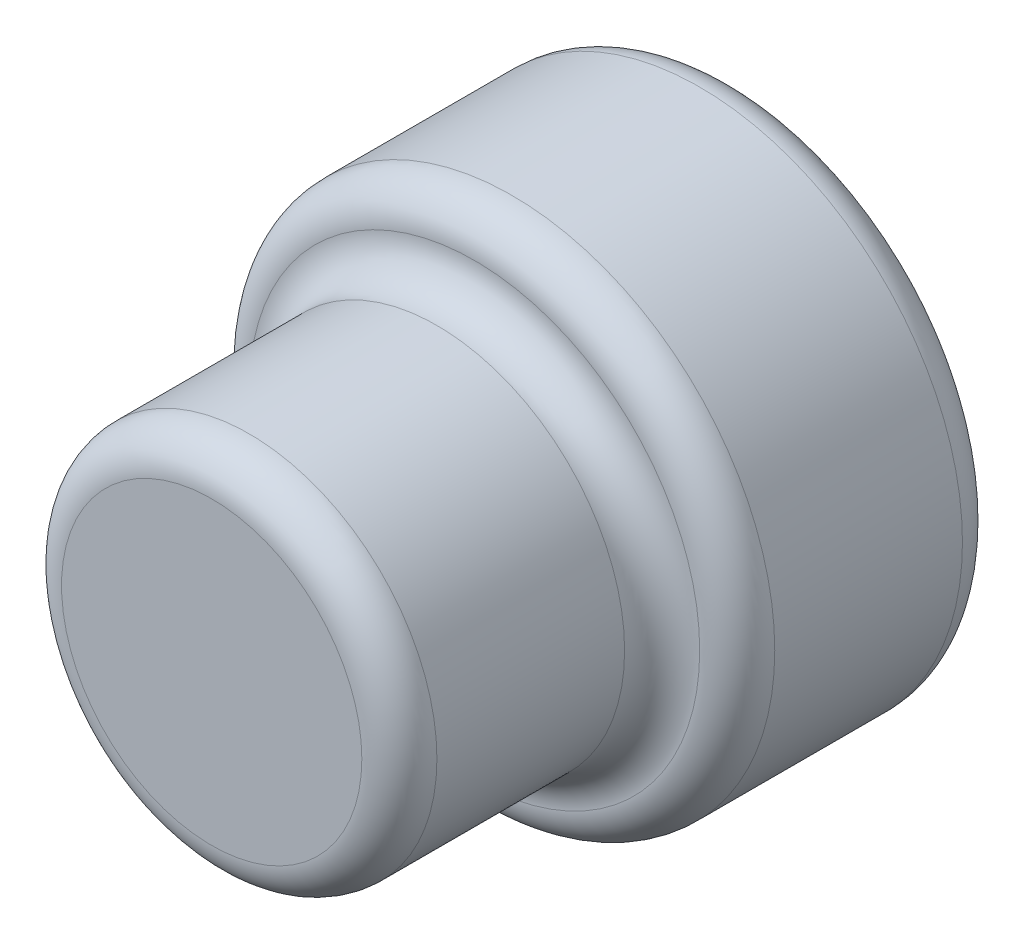
ISO-10303-21;
HEADER;
FILE_DESCRIPTION(('STEP AP214'),'2;1');
FILE_NAME('part.step','',(''),(''),'','','');
FILE_SCHEMA(('AUTOMOTIVE_DESIGN { 1 0 10303 214 1 1 1 1 }'));
ENDSEC;
DATA;
#1=APPLICATION_CONTEXT('core data for automotive mechanical design processes');
#2=APPLICATION_PROTOCOL_DEFINITION('international standard','automotive_design',2000,#1);
#3=PRODUCT_CONTEXT('',#1,'mechanical');
#4=PRODUCT('Part','Part','',(#3));
#5=PRODUCT_RELATED_PRODUCT_CATEGORY('part','',(#4));
#6=PRODUCT_DEFINITION_FORMATION('','',#4);
#7=PRODUCT_DEFINITION_CONTEXT('part definition',#1,'design');
#8=PRODUCT_DEFINITION('design','',#6,#7);
#9=PRODUCT_DEFINITION_SHAPE('','',#8);
#10=(LENGTH_UNIT() NAMED_UNIT(*) SI_UNIT(.MILLI.,.METRE.));
#11=(NAMED_UNIT(*) PLANE_ANGLE_UNIT() SI_UNIT($,.RADIAN.));
#12=(NAMED_UNIT(*) SI_UNIT($,.STERADIAN.) SOLID_ANGLE_UNIT());
#13=UNCERTAINTY_MEASURE_WITH_UNIT(LENGTH_MEASURE(1.E-05),#10,'distance_accuracy_value','');
#14=(GEOMETRIC_REPRESENTATION_CONTEXT(3) GLOBAL_UNCERTAINTY_ASSIGNED_CONTEXT((#13)) GLOBAL_UNIT_ASSIGNED_CONTEXT((#10,
#11,#12)) REPRESENTATION_CONTEXT('',''));
#15=CARTESIAN_POINT('',(0.,0.,0.));
#16=DIRECTION('',(0.,0.,1.));
#17=DIRECTION('',(1.,0.,0.));
#18=AXIS2_PLACEMENT_3D('',#15,#16,#17);
#19=CARTESIAN_POINT('',(0.,0.,7.));
#20=DIRECTION('',(0.,0.,-1.));
#21=DIRECTION('',(-1.,0.,0.));
#22=AXIS2_PLACEMENT_3D('',#19,#20,#21);
#23=CYLINDRICAL_SURFACE('',#22,7.);
#24=CARTESIAN_POINT('',(0.,0.,1.));
#25=DIRECTION('',(0.,0.,1.));
#26=DIRECTION('',(1.,0.,0.));
#27=AXIS2_PLACEMENT_3D('',#24,#25,#26);
#28=CIRCLE('',#27,7.);
#29=CARTESIAN_POINT('',(7.,0.,1.));
#30=VERTEX_POINT('',#29);
#31=EDGE_CURVE('E71',#30,#30,#28,.T.);
#32=ORIENTED_EDGE('',*,*,#31,.T.);
#33=EDGE_LOOP('',(#32));
#34=FACE_BOUND('',#33,.T.);
#35=CARTESIAN_POINT('',(0.,0.,6.));
#36=DIRECTION('',(0.,0.,1.));
#37=DIRECTION('',(1.,0.,0.));
#38=AXIS2_PLACEMENT_3D('',#35,#36,#37);
#39=CIRCLE('',#38,7.);
#40=CARTESIAN_POINT('',(7.,0.,6.));
#41=VERTEX_POINT('',#40);
#42=EDGE_CURVE('E75',#41,#41,#39,.F.);
#43=ORIENTED_EDGE('',*,*,#42,.T.);
#44=EDGE_LOOP('',(#43));
#45=FACE_BOUND('',#44,.T.);
#46=ADVANCED_FACE('F43',(#34,#45),#23,.T.);
#47=CARTESIAN_POINT('',(0.,0.,0.));
#48=DIRECTION('',(0.,0.,1.));
#49=DIRECTION('',(1.,0.,0.));
#50=AXIS2_PLACEMENT_3D('',#47,#48,#49);
#51=PLANE('',#50);
#52=CARTESIAN_POINT('',(0.,0.,0.));
#53=DIRECTION('',(0.,0.,1.));
#54=DIRECTION('',(1.,0.,0.));
#55=AXIS2_PLACEMENT_3D('',#52,#53,#54);
#56=CIRCLE('',#55,6.);
#57=CARTESIAN_POINT('',(6.,0.,0.));
#58=VERTEX_POINT('',#57);
#59=EDGE_CURVE('E67',#58,#58,#56,.F.);
#60=ORIENTED_EDGE('',*,*,#59,.T.);
#61=EDGE_LOOP('',(#60));
#62=FACE_BOUND('',#61,.T.);
#63=ADVANCED_FACE('F98',(#62),#51,.F.);
#64=CARTESIAN_POINT('',(0.,0.,1.));
#65=DIRECTION('',(0.,0.,1.));
#66=DIRECTION('',(1.,0.,0.));
#67=AXIS2_PLACEMENT_3D('',#64,#65,#66);
#68=TOROIDAL_SURFACE('',#67,6.,1.);
#69=ORIENTED_EDGE('',*,*,#59,.F.);
#70=EDGE_LOOP('',(#69));
#71=FACE_BOUND('',#70,.T.);
#72=ORIENTED_EDGE('',*,*,#31,.F.);
#73=EDGE_LOOP('',(#72));
#74=FACE_BOUND('',#73,.T.);
#75=ADVANCED_FACE('F85',(#71,#74),#68,.T.);
#76=CARTESIAN_POINT('',(0.,0.,6.));
#77=DIRECTION('',(0.,0.,1.));
#78=DIRECTION('',(1.,0.,0.));
#79=AXIS2_PLACEMENT_3D('',#76,#77,#78);
#80=TOROIDAL_SURFACE('',#79,6.,1.);
#81=ORIENTED_EDGE('',*,*,#42,.F.);
#82=EDGE_LOOP('',(#81));
#83=FACE_BOUND('',#82,.T.);
#84=CARTESIAN_POINT('',(0.,0.,7.));
#85=DIRECTION('',(0.,0.,1.));
#86=DIRECTION('',(1.,0.,0.));
#87=AXIS2_PLACEMENT_3D('',#84,#85,#86);
#88=CIRCLE('',#87,6.);
#89=CARTESIAN_POINT('',(6.,0.,7.));
#90=VERTEX_POINT('',#89);
#91=EDGE_CURVE('E61',#90,#90,#88,.T.);
#92=ORIENTED_EDGE('',*,*,#91,.F.);
#93=EDGE_LOOP('',(#92));
#94=FACE_BOUND('',#93,.T.);
#95=ADVANCED_FACE('F81',(#83,#94),#80,.T.);
#96=CARTESIAN_POINT('',(0.,0.,14.));
#97=DIRECTION('',(0.,0.,-1.));
#98=DIRECTION('',(-1.,0.,0.));
#99=AXIS2_PLACEMENT_3D('',#96,#97,#98);
#100=CYLINDRICAL_SURFACE('',#99,5.);
#101=CARTESIAN_POINT('',(0.,0.,13.));
#102=DIRECTION('',(0.,0.,1.));
#103=DIRECTION('',(1.,0.,0.));
#104=AXIS2_PLACEMENT_3D('',#101,#102,#103);
#105=CIRCLE('',#104,5.);
#106=CARTESIAN_POINT('',(5.,0.,13.));
#107=VERTEX_POINT('',#106);
#108=EDGE_CURVE('E10',#107,#107,#105,.F.);
#109=ORIENTED_EDGE('',*,*,#108,.T.);
#110=EDGE_LOOP('',(#109));
#111=FACE_BOUND('',#110,.T.);
#112=CARTESIAN_POINT('',(0.,0.,8.));
#113=DIRECTION('',(0.,0.,1.));
#114=DIRECTION('',(1.,0.,0.));
#115=AXIS2_PLACEMENT_3D('',#112,#113,#114);
#116=CIRCLE('',#115,5.);
#117=CARTESIAN_POINT('',(5.,0.,8.));
#118=VERTEX_POINT('',#117);
#119=EDGE_CURVE('E51',#118,#118,#116,.T.);
#120=ORIENTED_EDGE('',*,*,#119,.T.);
#121=EDGE_LOOP('',(#120));
#122=FACE_BOUND('',#121,.T.);
#123=ADVANCED_FACE('F84',(#111,#122),#100,.T.);
#124=CARTESIAN_POINT('',(0.,0.,14.));
#125=DIRECTION('',(0.,0.,1.));
#126=DIRECTION('',(1.,0.,0.));
#127=AXIS2_PLACEMENT_3D('',#124,#125,#126);
#128=PLANE('',#127);
#129=CARTESIAN_POINT('',(0.,0.,14.));
#130=DIRECTION('',(0.,0.,1.));
#131=DIRECTION('',(1.,0.,0.));
#132=AXIS2_PLACEMENT_3D('',#129,#130,#131);
#133=CIRCLE('',#132,4.);
#134=CARTESIAN_POINT('',(4.,0.,14.));
#135=VERTEX_POINT('',#134);
#136=EDGE_CURVE('E56',#135,#135,#133,.T.);
#137=ORIENTED_EDGE('',*,*,#136,.T.);
#138=EDGE_LOOP('',(#137));
#139=FACE_BOUND('',#138,.T.);
#140=ADVANCED_FACE('F95',(#139),#128,.T.);
#141=CARTESIAN_POINT('',(0.,0.,13.));
#142=DIRECTION('',(0.,0.,1.));
#143=DIRECTION('',(1.,0.,0.));
#144=AXIS2_PLACEMENT_3D('',#141,#142,#143);
#145=TOROIDAL_SURFACE('',#144,4.,1.);
#146=ORIENTED_EDGE('',*,*,#108,.F.);
#147=EDGE_LOOP('',(#146));
#148=FACE_BOUND('',#147,.T.);
#149=ORIENTED_EDGE('',*,*,#136,.F.);
#150=EDGE_LOOP('',(#149));
#151=FACE_BOUND('',#150,.T.);
#152=ADVANCED_FACE('F91',(#148,#151),#145,.T.);
#153=CARTESIAN_POINT('',(0.,0.,8.));
#154=DIRECTION('',(0.,0.,1.));
#155=DIRECTION('',(1.,0.,0.));
#156=AXIS2_PLACEMENT_3D('',#153,#154,#155);
#157=TOROIDAL_SURFACE('',#156,6.,1.);
#158=ORIENTED_EDGE('',*,*,#91,.T.);
#159=EDGE_LOOP('',(#158));
#160=FACE_BOUND('',#159,.T.);
#161=ORIENTED_EDGE('',*,*,#119,.F.);
#162=EDGE_LOOP('',(#161));
#163=FACE_BOUND('',#162,.T.);
#164=ADVANCED_FACE('F45',(#160,#163),#157,.F.);
#165=CLOSED_SHELL('',(#46,#63,#75,#95,#123,#140,#152,#164));
#166=MANIFOLD_SOLID_BREP('B2',#165);
#167=ADVANCED_BREP_SHAPE_REPRESENTATION('',(#18,#166),#14);
#168=SHAPE_DEFINITION_REPRESENTATION(#9,#167);
ENDSEC;
END-ISO-10303-21;
